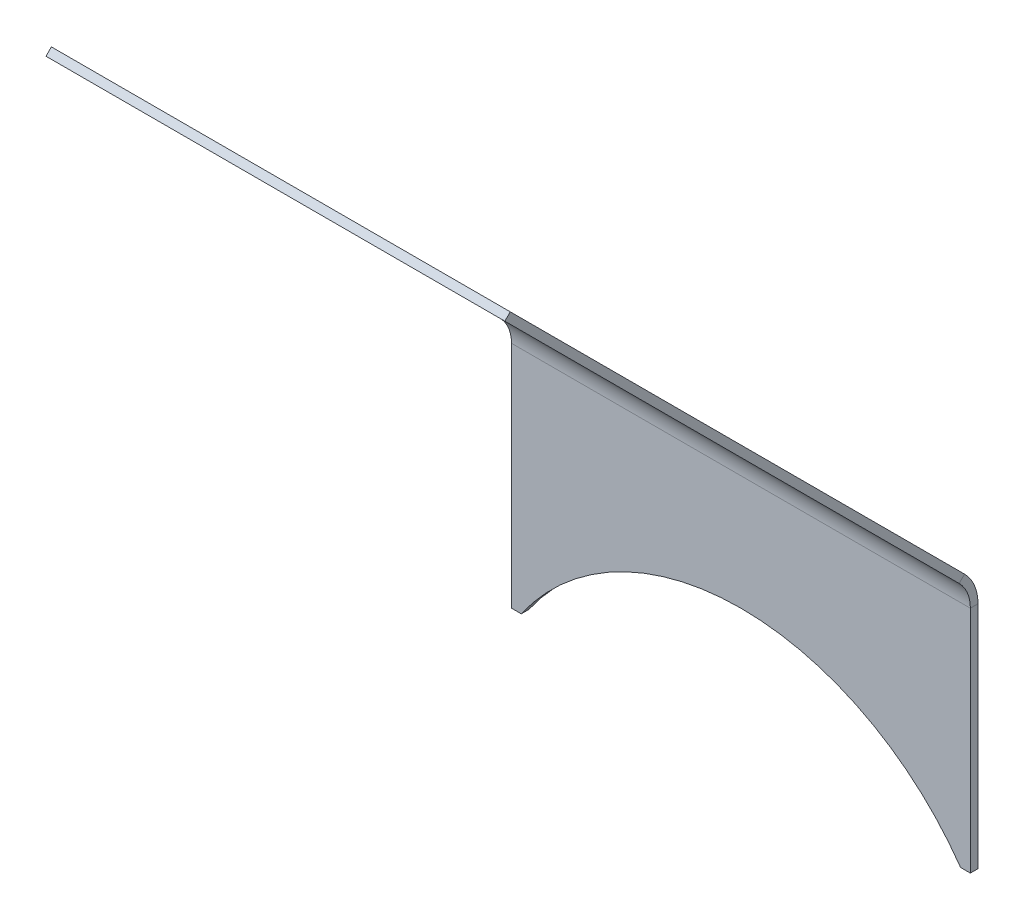
ISO-10303-21;
HEADER;
FILE_DESCRIPTION(('STEP AP214'),'2;1');
FILE_NAME('part.step','',(''),(''),'','','');
FILE_SCHEMA(('AUTOMOTIVE_DESIGN { 1 0 10303 214 1 1 1 1 }'));
ENDSEC;
DATA;
#1=APPLICATION_CONTEXT('core data for automotive mechanical design processes');
#2=APPLICATION_PROTOCOL_DEFINITION('international standard','automotive_design',2000,#1);
#3=PRODUCT_CONTEXT('',#1,'mechanical');
#4=PRODUCT('Part','Part','',(#3));
#5=PRODUCT_RELATED_PRODUCT_CATEGORY('part','',(#4));
#6=PRODUCT_DEFINITION_FORMATION('','',#4);
#7=PRODUCT_DEFINITION_CONTEXT('part definition',#1,'design');
#8=PRODUCT_DEFINITION('design','',#6,#7);
#9=PRODUCT_DEFINITION_SHAPE('','',#8);
#10=(LENGTH_UNIT() NAMED_UNIT(*) SI_UNIT(.MILLI.,.METRE.));
#11=(NAMED_UNIT(*) PLANE_ANGLE_UNIT() SI_UNIT($,.RADIAN.));
#12=(NAMED_UNIT(*) SI_UNIT($,.STERADIAN.) SOLID_ANGLE_UNIT());
#13=UNCERTAINTY_MEASURE_WITH_UNIT(LENGTH_MEASURE(1.E-05),#10,'distance_accuracy_value','');
#14=(GEOMETRIC_REPRESENTATION_CONTEXT(3) GLOBAL_UNCERTAINTY_ASSIGNED_CONTEXT((#13)) GLOBAL_UNIT_ASSIGNED_CONTEXT((#10,
#11,#12)) REPRESENTATION_CONTEXT('',''));
#15=CARTESIAN_POINT('',(0.,0.,0.));
#16=DIRECTION('',(0.,0.,1.));
#17=DIRECTION('',(1.,0.,0.));
#18=AXIS2_PLACEMENT_3D('',#15,#16,#17);
#19=CARTESIAN_POINT('',(0.,0.,2.));
#20=DIRECTION('',(0.,1.,0.));
#21=DIRECTION('',(-1.,0.,0.));
#22=AXIS2_PLACEMENT_3D('',#19,#20,#21);
#23=PLANE('',#22);
#24=DIRECTION('',(0.,0.,-1.));
#25=VECTOR('',#24,1.);
#26=CARTESIAN_POINT('',(117.44562646538,0.,123.744686707645));
#27=LINE('',#26,#25);
#28=CARTESIAN_POINT('',(117.44562646538,0.,2.));
#29=VERTEX_POINT('',#28);
#30=CARTESIAN_POINT('',(117.44562646538,0.,0.));
#31=VERTEX_POINT('',#30);
#32=EDGE_CURVE('E145',#29,#31,#27,.T.);
#33=ORIENTED_EDGE('',*,*,#32,.T.);
#34=DIRECTION('',(1.,0.,0.));
#35=VECTOR('',#34,1.);
#36=CARTESIAN_POINT('',(0.,0.,0.));
#37=LINE('',#36,#35);
#38=CARTESIAN_POINT('',(120.,0.,0.));
#39=VERTEX_POINT('',#38);
#40=EDGE_CURVE('E155',#31,#39,#37,.T.);
#41=ORIENTED_EDGE('',*,*,#40,.T.);
#42=DIRECTION('',(0.,0.,-1.));
#43=VECTOR('',#42,1.);
#44=CARTESIAN_POINT('',(120.,0.,2.));
#45=LINE('',#44,#43);
#46=CARTESIAN_POINT('',(120.,0.,2.));
#47=VERTEX_POINT('',#46);
#48=EDGE_CURVE('E66',#47,#39,#45,.T.);
#49=ORIENTED_EDGE('',*,*,#48,.F.);
#50=DIRECTION('',(1.,0.,0.));
#51=VECTOR('',#50,1.);
#52=CARTESIAN_POINT('',(0.,0.,2.));
#53=LINE('',#52,#51);
#54=EDGE_CURVE('E156',#29,#47,#53,.T.);
#55=ORIENTED_EDGE('',*,*,#54,.F.);
#56=EDGE_LOOP('',(#33,#41,#49,#55));
#57=FACE_BOUND('',#56,.T.);
#58=ADVANCED_FACE('F58',(#57),#23,.F.);
#59=DIRECTION('',(0.,0.,-1.));
#60=VECTOR('',#59,1.);
#61=CARTESIAN_POINT('',(2.55437353461967,0.,123.744686707645));
#62=LINE('',#61,#60);
#63=CARTESIAN_POINT('',(2.55437353461967,0.,0.));
#64=VERTEX_POINT('',#63);
#65=CARTESIAN_POINT('',(2.55437353461967,0.,2.));
#66=VERTEX_POINT('',#65);
#67=EDGE_CURVE('E73',#64,#66,#62,.F.);
#68=ORIENTED_EDGE('',*,*,#67,.T.);
#69=CARTESIAN_POINT('',(0.,0.,2.));
#70=VERTEX_POINT('',#69);
#71=EDGE_CURVE('E107',#70,#66,#53,.T.);
#72=ORIENTED_EDGE('',*,*,#71,.F.);
#73=DIRECTION('',(0.,0.,-1.));
#74=VECTOR('',#73,1.);
#75=CARTESIAN_POINT('',(0.,0.,2.));
#76=LINE('',#75,#74);
#77=CARTESIAN_POINT('',(0.,0.,0.));
#78=VERTEX_POINT('',#77);
#79=EDGE_CURVE('E13',#70,#78,#76,.T.);
#80=ORIENTED_EDGE('',*,*,#79,.T.);
#81=EDGE_CURVE('E159',#78,#64,#37,.T.);
#82=ORIENTED_EDGE('',*,*,#81,.T.);
#83=EDGE_LOOP('',(#68,#72,#80,#82));
#84=FACE_BOUND('',#83,.T.);
#85=ADVANCED_FACE('F226',(#84),#23,.F.);
#86=CARTESIAN_POINT('',(0.,0.,2.));
#87=DIRECTION('',(0.,0.,1.));
#88=DIRECTION('',(1.,0.,0.));
#89=AXIS2_PLACEMENT_3D('',#86,#87,#88);
#90=PLANE('',#89);
#91=ORIENTED_EDGE('',*,*,#71,.T.);
#92=CARTESIAN_POINT('',(60.,-40.,2.));
#93=DIRECTION('',(0.,0.,1.));
#94=DIRECTION('',(1.,0.,0.));
#95=AXIS2_PLACEMENT_3D('',#92,#93,#94);
#96=CIRCLE('',#95,70.);
#97=EDGE_CURVE('E150',#29,#66,#96,.T.);
#98=ORIENTED_EDGE('',*,*,#97,.F.);
#99=ORIENTED_EDGE('',*,*,#54,.T.);
#100=DIRECTION('',(0.,1.,0.));
#101=VECTOR('',#100,1.);
#102=CARTESIAN_POINT('',(120.,0.,2.));
#103=LINE('',#102,#101);
#104=CARTESIAN_POINT('',(120.,60.,2.));
#105=VERTEX_POINT('',#104);
#106=EDGE_CURVE('E179',#47,#105,#103,.T.);
#107=ORIENTED_EDGE('',*,*,#106,.T.);
#108=DIRECTION('',(-1.,0.,0.));
#109=VECTOR('',#108,1.);
#110=CARTESIAN_POINT('',(120.,60.,2.));
#111=LINE('',#110,#109);
#112=CARTESIAN_POINT('',(0.,60.,2.));
#113=VERTEX_POINT('',#112);
#114=EDGE_CURVE('E82',#105,#113,#111,.T.);
#115=ORIENTED_EDGE('',*,*,#114,.T.);
#116=DIRECTION('',(0.,-1.,0.));
#117=VECTOR('',#116,1.);
#118=CARTESIAN_POINT('',(0.,60.,2.));
#119=LINE('',#118,#117);
#120=EDGE_CURVE('E171',#113,#70,#119,.T.);
#121=ORIENTED_EDGE('',*,*,#120,.T.);
#122=EDGE_LOOP('',(#91,#98,#99,#107,#115,#121));
#123=FACE_BOUND('',#122,.T.);
#124=ADVANCED_FACE('F227',(#123),#90,.T.);
#125=CARTESIAN_POINT('',(0.,0.,0.));
#126=DIRECTION('',(0.,0.,1.));
#127=DIRECTION('',(1.,0.,0.));
#128=AXIS2_PLACEMENT_3D('',#125,#126,#127);
#129=PLANE('',#128);
#130=CARTESIAN_POINT('',(60.,-40.,0.));
#131=DIRECTION('',(0.,0.,1.));
#132=DIRECTION('',(1.,0.,0.));
#133=AXIS2_PLACEMENT_3D('',#130,#131,#132);
#134=CIRCLE('',#133,70.);
#135=EDGE_CURVE('E142',#31,#64,#134,.T.);
#136=ORIENTED_EDGE('',*,*,#135,.T.);
#137=ORIENTED_EDGE('',*,*,#81,.F.);
#138=DIRECTION('',(0.,-1.,0.));
#139=VECTOR('',#138,1.);
#140=CARTESIAN_POINT('',(0.,60.,0.));
#141=LINE('',#140,#139);
#142=CARTESIAN_POINT('',(0.,60.,0.));
#143=VERTEX_POINT('',#142);
#144=EDGE_CURVE('E160',#143,#78,#141,.T.);
#145=ORIENTED_EDGE('',*,*,#144,.F.);
#146=DIRECTION('',(-1.,0.,0.));
#147=VECTOR('',#146,1.);
#148=CARTESIAN_POINT('',(120.,60.,0.));
#149=LINE('',#148,#147);
#150=CARTESIAN_POINT('',(120.,60.,0.));
#151=VERTEX_POINT('',#150);
#152=EDGE_CURVE('E168',#151,#143,#149,.T.);
#153=ORIENTED_EDGE('',*,*,#152,.F.);
#154=DIRECTION('',(0.,1.,0.));
#155=VECTOR('',#154,1.);
#156=CARTESIAN_POINT('',(120.,0.,0.));
#157=LINE('',#156,#155);
#158=EDGE_CURVE('E101',#39,#151,#157,.T.);
#159=ORIENTED_EDGE('',*,*,#158,.F.);
#160=ORIENTED_EDGE('',*,*,#40,.F.);
#161=EDGE_LOOP('',(#136,#137,#145,#153,#159,#160));
#162=FACE_BOUND('',#161,.T.);
#163=ADVANCED_FACE('F158',(#162),#129,.F.);
#164=CARTESIAN_POINT('',(0.,60.,2.));
#165=DIRECTION('',(1.,0.,0.));
#166=DIRECTION('',(0.,1.,0.));
#167=AXIS2_PLACEMENT_3D('',#164,#165,#166);
#168=PLANE('',#167);
#169=ORIENTED_EDGE('',*,*,#144,.T.);
#170=ORIENTED_EDGE('',*,*,#79,.F.);
#171=ORIENTED_EDGE('',*,*,#120,.F.);
#172=DIRECTION('',(0.,0.,-1.));
#173=VECTOR('',#172,1.);
#174=CARTESIAN_POINT('',(0.,60.,2.));
#175=LINE('',#174,#173);
#176=EDGE_CURVE('E172',#113,#143,#175,.T.);
#177=ORIENTED_EDGE('',*,*,#176,.T.);
#178=EDGE_LOOP('',(#169,#170,#171,#177));
#179=FACE_BOUND('',#178,.T.);
#180=ADVANCED_FACE('F60',(#179),#168,.F.);
#181=CARTESIAN_POINT('',(120.,0.,2.));
#182=DIRECTION('',(-1.,0.,0.));
#183=DIRECTION('',(0.,-1.,0.));
#184=AXIS2_PLACEMENT_3D('',#181,#182,#183);
#185=PLANE('',#184);
#186=ORIENTED_EDGE('',*,*,#158,.T.);
#187=DIRECTION('',(0.,0.,-1.));
#188=VECTOR('',#187,1.);
#189=CARTESIAN_POINT('',(120.,60.,2.));
#190=LINE('',#189,#188);
#191=EDGE_CURVE('E175',#105,#151,#190,.T.);
#192=ORIENTED_EDGE('',*,*,#191,.F.);
#193=ORIENTED_EDGE('',*,*,#106,.F.);
#194=ORIENTED_EDGE('',*,*,#48,.T.);
#195=EDGE_LOOP('',(#186,#192,#193,#194));
#196=FACE_BOUND('',#195,.T.);
#197=ADVANCED_FACE('F178',(#196),#185,.F.);
#198=CARTESIAN_POINT('',(120.,60.,12.));
#199=DIRECTION('',(1.,0.,0.));
#200=DIRECTION('',(0.,0.,-1.));
#201=AXIS2_PLACEMENT_3D('',#198,#199,#200);
#202=PLANE('',#201);
#203=DIRECTION('',(0.,-0.707106781186544,0.707106781186551));
#204=VECTOR('',#203,1.);
#205=CARTESIAN_POINT('',(120.,68.4852813742385,3.5147186257614));
#206=LINE('',#205,#204);
#207=CARTESIAN_POINT('',(120.,67.0710678118654,4.9289321881345));
#208=VERTEX_POINT('',#207);
#209=CARTESIAN_POINT('',(120.,68.4852813742385,3.5147186257614));
#210=VERTEX_POINT('',#209);
#211=EDGE_CURVE('E196',#208,#210,#206,.F.);
#212=ORIENTED_EDGE('',*,*,#211,.F.);
#213=CARTESIAN_POINT('',(120.,60.,12.));
#214=DIRECTION('',(-1.,0.,0.));
#215=DIRECTION('',(0.,0.,1.));
#216=AXIS2_PLACEMENT_3D('',#213,#214,#215);
#217=CIRCLE('',#216,10.);
#218=EDGE_CURVE('E187',#105,#208,#217,.F.);
#219=ORIENTED_EDGE('',*,*,#218,.F.);
#220=ORIENTED_EDGE('',*,*,#191,.T.);
#221=CARTESIAN_POINT('',(120.,60.,12.));
#222=DIRECTION('',(-1.,0.,0.));
#223=DIRECTION('',(0.,0.,1.));
#224=AXIS2_PLACEMENT_3D('',#221,#222,#223);
#225=CIRCLE('',#224,12.);
#226=EDGE_CURVE('E163',#151,#210,#225,.F.);
#227=ORIENTED_EDGE('',*,*,#226,.T.);
#228=EDGE_LOOP('',(#212,#219,#220,#227));
#229=FACE_BOUND('',#228,.T.);
#230=ADVANCED_FACE('F235',(#229),#202,.T.);
#231=CARTESIAN_POINT('',(0.,60.,12.));
#232=DIRECTION('',(1.,0.,0.));
#233=DIRECTION('',(0.,0.,-1.));
#234=AXIS2_PLACEMENT_3D('',#231,#232,#233);
#235=PLANE('',#234);
#236=CARTESIAN_POINT('',(0.,60.,12.));
#237=DIRECTION('',(-1.,0.,0.));
#238=DIRECTION('',(0.,0.,1.));
#239=AXIS2_PLACEMENT_3D('',#236,#237,#238);
#240=CIRCLE('',#239,10.);
#241=CARTESIAN_POINT('',(0.,67.0710678118654,4.9289321881345));
#242=VERTEX_POINT('',#241);
#243=EDGE_CURVE('E184',#242,#113,#240,.T.);
#244=ORIENTED_EDGE('',*,*,#243,.F.);
#245=DIRECTION('',(0.,-0.707106781186544,0.707106781186551));
#246=VECTOR('',#245,1.);
#247=CARTESIAN_POINT('',(0.,67.0710678118654,4.9289321881345));
#248=LINE('',#247,#246);
#249=CARTESIAN_POINT('',(0.,68.4852813742385,3.51471862576141));
#250=VERTEX_POINT('',#249);
#251=EDGE_CURVE('E201',#242,#250,#248,.F.);
#252=ORIENTED_EDGE('',*,*,#251,.T.);
#253=CARTESIAN_POINT('',(0.,60.,12.));
#254=DIRECTION('',(-1.,0.,0.));
#255=DIRECTION('',(0.,0.,1.));
#256=AXIS2_PLACEMENT_3D('',#253,#254,#255);
#257=CIRCLE('',#256,12.);
#258=EDGE_CURVE('E191',#250,#143,#257,.T.);
#259=ORIENTED_EDGE('',*,*,#258,.T.);
#260=ORIENTED_EDGE('',*,*,#176,.F.);
#261=EDGE_LOOP('',(#244,#252,#259,#260));
#262=FACE_BOUND('',#261,.T.);
#263=ADVANCED_FACE('F280',(#262),#235,.F.);
#264=CARTESIAN_POINT('',(0.,60.,12.));
#265=DIRECTION('',(-1.,0.,0.));
#266=DIRECTION('',(0.,0.707106781186544,-0.707106781186551));
#267=AXIS2_PLACEMENT_3D('',#264,#265,#266);
#268=CYLINDRICAL_SURFACE('',#267,12.);
#269=ORIENTED_EDGE('',*,*,#152,.T.);
#270=ORIENTED_EDGE('',*,*,#258,.F.);
#271=DIRECTION('',(-1.,0.,0.));
#272=VECTOR('',#271,1.);
#273=CARTESIAN_POINT('',(120.,68.4852813742385,3.51471862576141));
#274=LINE('',#273,#272);
#275=EDGE_CURVE('E204',#250,#210,#274,.F.);
#276=ORIENTED_EDGE('',*,*,#275,.T.);
#277=ORIENTED_EDGE('',*,*,#226,.F.);
#278=EDGE_LOOP('',(#269,#270,#276,#277));
#279=FACE_BOUND('',#278,.T.);
#280=ADVANCED_FACE('F236',(#279),#268,.T.);
#281=CARTESIAN_POINT('',(0.,60.,12.));
#282=DIRECTION('',(-1.,0.,0.));
#283=DIRECTION('',(0.,0.707106781186544,-0.707106781186551));
#284=AXIS2_PLACEMENT_3D('',#281,#282,#283);
#285=CYLINDRICAL_SURFACE('',#284,10.);
#286=ORIENTED_EDGE('',*,*,#114,.F.);
#287=ORIENTED_EDGE('',*,*,#218,.T.);
#288=DIRECTION('',(-1.,0.,0.));
#289=VECTOR('',#288,1.);
#290=CARTESIAN_POINT('',(120.,67.0710678118654,4.9289321881345));
#291=LINE('',#290,#289);
#292=EDGE_CURVE('E199',#208,#242,#291,.T.);
#293=ORIENTED_EDGE('',*,*,#292,.T.);
#294=ORIENTED_EDGE('',*,*,#243,.T.);
#295=EDGE_LOOP('',(#286,#287,#293,#294));
#296=FACE_BOUND('',#295,.T.);
#297=ADVANCED_FACE('F257',(#296),#285,.F.);
#298=CARTESIAN_POINT('',(120.,65.556349186104,0.58578643762691));
#299=DIRECTION('',(-1.,0.,0.));
#300=DIRECTION('',(0.,0.,1.));
#301=AXIS2_PLACEMENT_3D('',#298,#299,#300);
#302=PLANE('',#301);
#303=ORIENTED_EDGE('',*,*,#211,.T.);
#304=DIRECTION('',(0.,-0.707106781186551,-0.707106781186544));
#305=VECTOR('',#304,1.);
#306=CARTESIAN_POINT('',(120.,34.5563491861037,-30.4142135623731));
#307=LINE('',#306,#305);
#308=CARTESIAN_POINT('',(120.,187.300035893751,122.329473145272));
#309=VERTEX_POINT('',#308);
#310=EDGE_CURVE('E213',#309,#210,#307,.T.);
#311=ORIENTED_EDGE('',*,*,#310,.F.);
#312=DIRECTION('',(0.,-0.707106781186544,0.707106781186551));
#313=VECTOR('',#312,1.);
#314=CARTESIAN_POINT('',(120.,187.300035893751,122.329473145272));
#315=LINE('',#314,#313);
#316=CARTESIAN_POINT('',(120.,185.885822331377,123.743686707645));
#317=VERTEX_POINT('',#316);
#318=EDGE_CURVE('E220',#309,#317,#315,.T.);
#319=ORIENTED_EDGE('',*,*,#318,.T.);
#320=DIRECTION('',(0.,0.707106781186551,0.707106781186544));
#321=VECTOR('',#320,1.);
#322=CARTESIAN_POINT('',(120.,64.1421356237309,2.00000000000001));
#323=LINE('',#322,#321);
#324=EDGE_CURVE('E206',#317,#208,#323,.F.);
#325=ORIENTED_EDGE('',*,*,#324,.T.);
#326=EDGE_LOOP('',(#303,#311,#319,#325));
#327=FACE_BOUND('',#326,.T.);
#328=ADVANCED_FACE('F254',(#327),#302,.F.);
#329=CARTESIAN_POINT('',(0.,187.300035893751,122.329473145272));
#330=DIRECTION('',(1.,0.,0.));
#331=DIRECTION('',(0.,0.,-1.));
#332=AXIS2_PLACEMENT_3D('',#329,#330,#331);
#333=PLANE('',#332);
#334=ORIENTED_EDGE('',*,*,#251,.F.);
#335=DIRECTION('',(0.,-0.707106781186551,-0.707106781186544));
#336=VECTOR('',#335,1.);
#337=CARTESIAN_POINT('',(0.,185.885822331377,123.743686707645));
#338=LINE('',#337,#336);
#339=CARTESIAN_POINT('',(0.,185.885822331377,123.743686707645));
#340=VERTEX_POINT('',#339);
#341=EDGE_CURVE('E209',#242,#340,#338,.F.);
#342=ORIENTED_EDGE('',*,*,#341,.T.);
#343=DIRECTION('',(0.,-0.707106781186544,0.707106781186551));
#344=VECTOR('',#343,1.);
#345=CARTESIAN_POINT('',(0.,187.300035893751,122.329473145272));
#346=LINE('',#345,#344);
#347=CARTESIAN_POINT('',(0.,187.300035893751,122.329473145272));
#348=VERTEX_POINT('',#347);
#349=EDGE_CURVE('E188',#348,#340,#346,.T.);
#350=ORIENTED_EDGE('',*,*,#349,.F.);
#351=DIRECTION('',(0.,0.707106781186551,0.707106781186544));
#352=VECTOR('',#351,1.);
#353=CARTESIAN_POINT('',(0.,34.5563491861037,-30.4142135623731));
#354=LINE('',#353,#352);
#355=EDGE_CURVE('E216',#250,#348,#354,.T.);
#356=ORIENTED_EDGE('',*,*,#355,.F.);
#357=EDGE_LOOP('',(#334,#342,#350,#356));
#358=FACE_BOUND('',#357,.T.);
#359=ADVANCED_FACE('F245',(#358),#333,.F.);
#360=CARTESIAN_POINT('',(0.,34.5563491861037,-30.4142135623731));
#361=DIRECTION('',(0.,-0.707106781186544,0.707106781186551));
#362=DIRECTION('',(0.,-0.707106781186551,-0.707106781186544));
#363=AXIS2_PLACEMENT_3D('',#360,#361,#362);
#364=PLANE('',#363);
#365=ORIENTED_EDGE('',*,*,#275,.F.);
#366=ORIENTED_EDGE('',*,*,#355,.T.);
#367=DIRECTION('',(1.,0.,0.));
#368=VECTOR('',#367,1.);
#369=CARTESIAN_POINT('',(0.,187.300035893751,122.329473145272));
#370=LINE('',#369,#368);
#371=EDGE_CURVE('E218',#348,#309,#370,.T.);
#372=ORIENTED_EDGE('',*,*,#371,.T.);
#373=ORIENTED_EDGE('',*,*,#310,.T.);
#374=EDGE_LOOP('',(#365,#366,#372,#373));
#375=FACE_BOUND('',#374,.T.);
#376=ADVANCED_FACE('F240',(#375),#364,.F.);
#377=CARTESIAN_POINT('',(0.,33.1421356237306,-29.));
#378=DIRECTION('',(0.,-0.707106781186544,0.707106781186551));
#379=DIRECTION('',(0.,-0.707106781186551,-0.707106781186544));
#380=AXIS2_PLACEMENT_3D('',#377,#378,#379);
#381=PLANE('',#380);
#382=ORIENTED_EDGE('',*,*,#341,.F.);
#383=ORIENTED_EDGE('',*,*,#292,.F.);
#384=ORIENTED_EDGE('',*,*,#324,.F.);
#385=DIRECTION('',(-1.,0.,0.));
#386=VECTOR('',#385,1.);
#387=CARTESIAN_POINT('',(120.,185.885822331377,123.743686707645));
#388=LINE('',#387,#386);
#389=EDGE_CURVE('E211',#340,#317,#388,.F.);
#390=ORIENTED_EDGE('',*,*,#389,.F.);
#391=EDGE_LOOP('',(#382,#383,#384,#390));
#392=FACE_BOUND('',#391,.T.);
#393=ADVANCED_FACE('F260',(#392),#381,.T.);
#394=CARTESIAN_POINT('',(120.,187.300035893751,122.329473145272));
#395=DIRECTION('',(0.,-0.707106781186551,-0.707106781186544));
#396=DIRECTION('',(0.,0.707106781186544,-0.707106781186551));
#397=AXIS2_PLACEMENT_3D('',#394,#395,#396);
#398=PLANE('',#397);
#399=ORIENTED_EDGE('',*,*,#389,.T.);
#400=ORIENTED_EDGE('',*,*,#318,.F.);
#401=ORIENTED_EDGE('',*,*,#371,.F.);
#402=ORIENTED_EDGE('',*,*,#349,.T.);
#403=EDGE_LOOP('',(#399,#400,#401,#402));
#404=FACE_BOUND('',#403,.T.);
#405=ADVANCED_FACE('F251',(#404),#398,.F.);
#406=CARTESIAN_POINT('',(60.,-40.,123.744686707645));
#407=DIRECTION('',(0.,0.,-1.));
#408=DIRECTION('',(-1.,0.,0.));
#409=AXIS2_PLACEMENT_3D('',#406,#407,#408);
#410=CYLINDRICAL_SURFACE('',#409,70.);
#411=ORIENTED_EDGE('',*,*,#97,.T.);
#412=ORIENTED_EDGE('',*,*,#67,.F.);
#413=ORIENTED_EDGE('',*,*,#135,.F.);
#414=ORIENTED_EDGE('',*,*,#32,.F.);
#415=EDGE_LOOP('',(#411,#412,#413,#414));
#416=FACE_BOUND('',#415,.T.);
#417=ADVANCED_FACE('F144',(#416),#410,.F.);
#418=CLOSED_SHELL('',(#58,#85,#124,#163,#180,#197,#230,#263,#280,#297,#328,#359,#376,#393,#405,#417));
#419=MANIFOLD_SOLID_BREP('B2',#418);
#420=ADVANCED_BREP_SHAPE_REPRESENTATION('',(#18,#419),#14);
#421=SHAPE_DEFINITION_REPRESENTATION(#9,#420);
ENDSEC;
END-ISO-10303-21;
